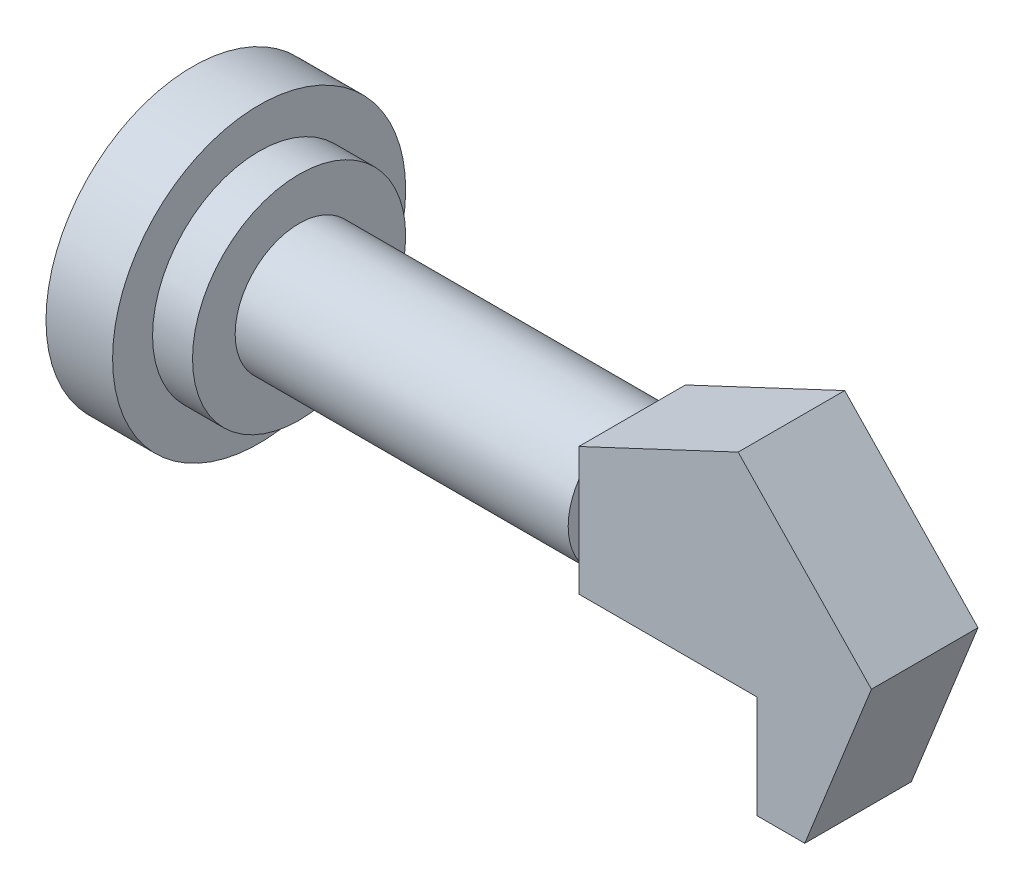
ISO-10303-21;
HEADER;
FILE_DESCRIPTION(('STEP AP214'),'2;1');
FILE_NAME('part.step','',(''),(''),'','','');
FILE_SCHEMA(('AUTOMOTIVE_DESIGN { 1 0 10303 214 1 1 1 1 }'));
ENDSEC;
DATA;
#1=APPLICATION_CONTEXT('core data for automotive mechanical design processes');
#2=APPLICATION_PROTOCOL_DEFINITION('international standard','automotive_design',2000,#1);
#3=PRODUCT_CONTEXT('',#1,'mechanical');
#4=PRODUCT('Part','Part','',(#3));
#5=PRODUCT_RELATED_PRODUCT_CATEGORY('part','',(#4));
#6=PRODUCT_DEFINITION_FORMATION('','',#4);
#7=PRODUCT_DEFINITION_CONTEXT('part definition',#1,'design');
#8=PRODUCT_DEFINITION('design','',#6,#7);
#9=PRODUCT_DEFINITION_SHAPE('','',#8);
#10=(LENGTH_UNIT() NAMED_UNIT(*) SI_UNIT(.MILLI.,.METRE.));
#11=(NAMED_UNIT(*) PLANE_ANGLE_UNIT() SI_UNIT($,.RADIAN.));
#12=(NAMED_UNIT(*) SI_UNIT($,.STERADIAN.) SOLID_ANGLE_UNIT());
#13=UNCERTAINTY_MEASURE_WITH_UNIT(LENGTH_MEASURE(1.E-05),#10,'distance_accuracy_value','');
#14=(GEOMETRIC_REPRESENTATION_CONTEXT(3) GLOBAL_UNCERTAINTY_ASSIGNED_CONTEXT((#13)) GLOBAL_UNIT_ASSIGNED_CONTEXT((#10,
#11,#12)) REPRESENTATION_CONTEXT('',''));
#15=CARTESIAN_POINT('',(0.,0.,0.));
#16=DIRECTION('',(0.,0.,1.));
#17=DIRECTION('',(1.,0.,0.));
#18=AXIS2_PLACEMENT_3D('',#15,#16,#17);
#19=CARTESIAN_POINT('',(33.,0.,0.));
#20=DIRECTION('',(-1.,0.,0.));
#21=DIRECTION('',(0.,0.,1.));
#22=AXIS2_PLACEMENT_3D('',#19,#20,#21);
#23=PLANE('',#22);
#24=DIRECTION('',(0.,-1.,0.));
#25=VECTOR('',#24,1.);
#26=CARTESIAN_POINT('',(33.,0.,4.));
#27=LINE('',#26,#25);
#28=CARTESIAN_POINT('',(33.,13.6532998322843,4.));
#29=VERTEX_POINT('',#28);
#30=CARTESIAN_POINT('',(33.,8.34670016771568,4.));
#31=VERTEX_POINT('',#30);
#32=EDGE_CURVE('E11',#29,#31,#27,.T.);
#33=ORIENTED_EDGE('',*,*,#32,.F.);
#34=CARTESIAN_POINT('',(33.,11.,0.));
#35=DIRECTION('',(-1.,0.,0.));
#36=DIRECTION('',(0.,0.,1.));
#37=AXIS2_PLACEMENT_3D('',#34,#35,#36);
#38=CIRCLE('',#37,4.8);
#39=EDGE_CURVE('E197',#31,#29,#38,.T.);
#40=ORIENTED_EDGE('',*,*,#39,.F.);
#41=EDGE_LOOP('',(#33,#40));
#42=FACE_BOUND('',#41,.T.);
#43=ADVANCED_FACE('F47',(#42),#23,.F.);
#44=CARTESIAN_POINT('',(0.,0.,0.));
#45=DIRECTION('',(1.,0.,0.));
#46=DIRECTION('',(0.,0.,-1.));
#47=AXIS2_PLACEMENT_3D('',#44,#45,#46);
#48=PLANE('',#47);
#49=CARTESIAN_POINT('',(0.,11.,0.));
#50=DIRECTION('',(-1.,0.,0.));
#51=DIRECTION('',(0.,0.,1.));
#52=AXIS2_PLACEMENT_3D('',#49,#50,#51);
#53=CIRCLE('',#52,11.);
#54=CARTESIAN_POINT('',(0.,11.,11.));
#55=VERTEX_POINT('',#54);
#56=EDGE_CURVE('E51',#55,#55,#53,.T.);
#57=ORIENTED_EDGE('',*,*,#56,.T.);
#58=EDGE_LOOP('',(#57));
#59=FACE_BOUND('',#58,.T.);
#60=ADVANCED_FACE('F49',(#59),#48,.F.);
#61=CARTESIAN_POINT('',(0.,11.,0.));
#62=DIRECTION('',(-1.,0.,0.));
#63=DIRECTION('',(0.,0.,1.));
#64=AXIS2_PLACEMENT_3D('',#61,#62,#63);
#65=CYLINDRICAL_SURFACE('',#64,11.);
#66=CARTESIAN_POINT('',(5.,11.,0.));
#67=DIRECTION('',(-1.,0.,0.));
#68=DIRECTION('',(0.,0.,1.));
#69=AXIS2_PLACEMENT_3D('',#66,#67,#68);
#70=CIRCLE('',#69,11.);
#71=CARTESIAN_POINT('',(5.,11.,11.));
#72=VERTEX_POINT('',#71);
#73=EDGE_CURVE('E231',#72,#72,#70,.T.);
#74=ORIENTED_EDGE('',*,*,#73,.T.);
#75=EDGE_LOOP('',(#74));
#76=FACE_BOUND('',#75,.T.);
#77=ORIENTED_EDGE('',*,*,#56,.F.);
#78=EDGE_LOOP('',(#77));
#79=FACE_BOUND('',#78,.T.);
#80=ADVANCED_FACE('F295',(#76,#79),#65,.T.);
#81=CARTESIAN_POINT('',(5.,0.,0.));
#82=DIRECTION('',(1.,0.,0.));
#83=DIRECTION('',(0.,0.,-1.));
#84=AXIS2_PLACEMENT_3D('',#81,#82,#83);
#85=PLANE('',#84);
#86=CARTESIAN_POINT('',(5.,11.,0.));
#87=DIRECTION('',(-1.,0.,0.));
#88=DIRECTION('',(0.,0.,1.));
#89=AXIS2_PLACEMENT_3D('',#86,#87,#88);
#90=CIRCLE('',#89,8.);
#91=CARTESIAN_POINT('',(5.,11.,8.));
#92=VERTEX_POINT('',#91);
#93=EDGE_CURVE('E228',#92,#92,#90,.T.);
#94=ORIENTED_EDGE('',*,*,#93,.T.);
#95=EDGE_LOOP('',(#94));
#96=FACE_BOUND('',#95,.T.);
#97=ORIENTED_EDGE('',*,*,#73,.F.);
#98=EDGE_LOOP('',(#97));
#99=FACE_BOUND('',#98,.T.);
#100=ADVANCED_FACE('F313',(#96,#99),#85,.T.);
#101=CARTESIAN_POINT('',(0.,11.,0.));
#102=DIRECTION('',(-1.,0.,0.));
#103=DIRECTION('',(0.,0.,1.));
#104=AXIS2_PLACEMENT_3D('',#101,#102,#103);
#105=CYLINDRICAL_SURFACE('',#104,8.);
#106=CARTESIAN_POINT('',(8.00000000000002,11.,0.));
#107=DIRECTION('',(-1.,0.,0.));
#108=DIRECTION('',(0.,0.,1.));
#109=AXIS2_PLACEMENT_3D('',#106,#107,#108);
#110=CIRCLE('',#109,8.);
#111=CARTESIAN_POINT('',(8.00000000000002,11.,8.));
#112=VERTEX_POINT('',#111);
#113=EDGE_CURVE('E224',#112,#112,#110,.T.);
#114=ORIENTED_EDGE('',*,*,#113,.T.);
#115=EDGE_LOOP('',(#114));
#116=FACE_BOUND('',#115,.T.);
#117=ORIENTED_EDGE('',*,*,#93,.F.);
#118=EDGE_LOOP('',(#117));
#119=FACE_BOUND('',#118,.T.);
#120=ADVANCED_FACE('F307',(#116,#119),#105,.T.);
#121=CARTESIAN_POINT('',(8.00000000000002,0.,0.));
#122=DIRECTION('',(-1.,0.,0.));
#123=DIRECTION('',(0.,0.,1.));
#124=AXIS2_PLACEMENT_3D('',#121,#122,#123);
#125=PLANE('',#124);
#126=ORIENTED_EDGE('',*,*,#113,.F.);
#127=EDGE_LOOP('',(#126));
#128=FACE_BOUND('',#127,.T.);
#129=CARTESIAN_POINT('',(8.00000000000002,11.,0.));
#130=DIRECTION('',(-1.,0.,0.));
#131=DIRECTION('',(0.,0.,1.));
#132=AXIS2_PLACEMENT_3D('',#129,#130,#131);
#133=CIRCLE('',#132,4.8);
#134=CARTESIAN_POINT('',(8.00000000000002,11.,4.8));
#135=VERTEX_POINT('',#134);
#136=EDGE_CURVE('E219',#135,#135,#133,.T.);
#137=ORIENTED_EDGE('',*,*,#136,.T.);
#138=EDGE_LOOP('',(#137));
#139=FACE_BOUND('',#138,.T.);
#140=ADVANCED_FACE('F304',(#128,#139),#125,.F.);
#141=CARTESIAN_POINT('',(0.,11.,0.));
#142=DIRECTION('',(-1.,0.,0.));
#143=DIRECTION('',(0.,0.,1.));
#144=AXIS2_PLACEMENT_3D('',#141,#142,#143);
#145=CYLINDRICAL_SURFACE('',#144,4.8);
#146=CARTESIAN_POINT('',(33.,15.8,0.));
#147=VERTEX_POINT('',#146);
#148=EDGE_CURVE('E215',#29,#147,#38,.T.);
#149=ORIENTED_EDGE('',*,*,#148,.T.);
#150=CARTESIAN_POINT('',(33.,13.6532998322843,-4.));
#151=VERTEX_POINT('',#150);
#152=EDGE_CURVE('E220',#147,#151,#38,.T.);
#153=ORIENTED_EDGE('',*,*,#152,.T.);
#154=CARTESIAN_POINT('',(33.,8.34670016771568,-4.));
#155=VERTEX_POINT('',#154);
#156=EDGE_CURVE('E274',#151,#155,#38,.T.);
#157=ORIENTED_EDGE('',*,*,#156,.T.);
#158=CARTESIAN_POINT('',(33.,6.2,0.));
#159=VERTEX_POINT('',#158);
#160=EDGE_CURVE('E248',#155,#159,#38,.T.);
#161=ORIENTED_EDGE('',*,*,#160,.T.);
#162=EDGE_CURVE('E284',#159,#31,#38,.T.);
#163=ORIENTED_EDGE('',*,*,#162,.T.);
#164=ORIENTED_EDGE('',*,*,#39,.T.);
#165=EDGE_LOOP('',(#149,#153,#157,#161,#163,#164));
#166=FACE_BOUND('',#165,.T.);
#167=ORIENTED_EDGE('',*,*,#136,.F.);
#168=EDGE_LOOP('',(#167));
#169=FACE_BOUND('',#168,.T.);
#170=ADVANCED_FACE('F278',(#166,#169),#145,.T.);
#171=ORIENTED_EDGE('',*,*,#156,.F.);
#172=DIRECTION('',(0.,-1.,0.));
#173=VECTOR('',#172,1.);
#174=CARTESIAN_POINT('',(33.,0.,-4.));
#175=LINE('',#174,#173);
#176=EDGE_CURVE('E57',#151,#155,#175,.T.);
#177=ORIENTED_EDGE('',*,*,#176,.T.);
#178=EDGE_LOOP('',(#171,#177));
#179=FACE_BOUND('',#178,.T.);
#180=ADVANCED_FACE('F275',(#179),#23,.F.);
#181=CARTESIAN_POINT('',(33.,0.,-4.));
#182=DIRECTION('',(-1.,0.,0.));
#183=DIRECTION('',(0.,0.,1.));
#184=AXIS2_PLACEMENT_3D('',#181,#182,#183);
#185=PLANE('',#184);
#186=ORIENTED_EDGE('',*,*,#148,.F.);
#187=CARTESIAN_POINT('',(33.,15.8,4.));
#188=VERTEX_POINT('',#187);
#189=EDGE_CURVE('E59',#188,#29,#27,.T.);
#190=ORIENTED_EDGE('',*,*,#189,.F.);
#191=DIRECTION('',(0.,0.,1.));
#192=VECTOR('',#191,1.);
#193=CARTESIAN_POINT('',(33.,15.8,-4.));
#194=LINE('',#193,#192);
#195=EDGE_CURVE('E203',#147,#188,#194,.T.);
#196=ORIENTED_EDGE('',*,*,#195,.F.);
#197=EDGE_LOOP('',(#186,#190,#196));
#198=FACE_BOUND('',#197,.T.);
#199=ADVANCED_FACE('F262',(#198),#185,.T.);
#200=ORIENTED_EDGE('',*,*,#152,.F.);
#201=CARTESIAN_POINT('',(33.,15.8,-4.));
#202=VERTEX_POINT('',#201);
#203=EDGE_CURVE('E199',#202,#147,#194,.T.);
#204=ORIENTED_EDGE('',*,*,#203,.F.);
#205=EDGE_CURVE('E141',#202,#151,#175,.T.);
#206=ORIENTED_EDGE('',*,*,#205,.T.);
#207=EDGE_LOOP('',(#200,#204,#206));
#208=FACE_BOUND('',#207,.T.);
#209=ADVANCED_FACE('F272',(#208),#185,.T.);
#210=ORIENTED_EDGE('',*,*,#160,.F.);
#211=CARTESIAN_POINT('',(33.,6.2,-4.));
#212=VERTEX_POINT('',#211);
#213=EDGE_CURVE('E67',#155,#212,#175,.T.);
#214=ORIENTED_EDGE('',*,*,#213,.T.);
#215=DIRECTION('',(0.,0.,1.));
#216=VECTOR('',#215,1.);
#217=CARTESIAN_POINT('',(33.,6.2,-4.));
#218=LINE('',#217,#216);
#219=EDGE_CURVE('E193',#212,#159,#218,.T.);
#220=ORIENTED_EDGE('',*,*,#219,.T.);
#221=EDGE_LOOP('',(#210,#214,#220));
#222=FACE_BOUND('',#221,.T.);
#223=ADVANCED_FACE('F246',(#222),#185,.T.);
#224=ORIENTED_EDGE('',*,*,#162,.F.);
#225=CARTESIAN_POINT('',(33.,6.2,4.));
#226=VERTEX_POINT('',#225);
#227=EDGE_CURVE('E198',#159,#226,#218,.T.);
#228=ORIENTED_EDGE('',*,*,#227,.T.);
#229=EDGE_CURVE('E60',#31,#226,#27,.T.);
#230=ORIENTED_EDGE('',*,*,#229,.F.);
#231=EDGE_LOOP('',(#224,#228,#230));
#232=FACE_BOUND('',#231,.T.);
#233=ADVANCED_FACE('F303',(#232),#185,.T.);
#234=CARTESIAN_POINT('',(0.,6.2,-4.));
#235=DIRECTION('',(0.,1.,0.));
#236=DIRECTION('',(0.,0.,1.));
#237=AXIS2_PLACEMENT_3D('',#234,#235,#236);
#238=PLANE('',#237);
#239=DIRECTION('',(0.,0.,1.));
#240=VECTOR('',#239,1.);
#241=CARTESIAN_POINT('',(46.3880944577165,6.2,-4.));
#242=LINE('',#241,#240);
#243=CARTESIAN_POINT('',(46.3880944577165,6.2,-4.));
#244=VERTEX_POINT('',#243);
#245=CARTESIAN_POINT('',(46.3880944577165,6.2,4.));
#246=VERTEX_POINT('',#245);
#247=EDGE_CURVE('E129',#244,#246,#242,.T.);
#248=ORIENTED_EDGE('',*,*,#247,.T.);
#249=DIRECTION('',(-1.,0.,0.));
#250=VECTOR('',#249,1.);
#251=CARTESIAN_POINT('',(0.,6.2,4.));
#252=LINE('',#251,#250);
#253=EDGE_CURVE('E133',#246,#226,#252,.T.);
#254=ORIENTED_EDGE('',*,*,#253,.T.);
#255=ORIENTED_EDGE('',*,*,#227,.F.);
#256=ORIENTED_EDGE('',*,*,#219,.F.);
#257=DIRECTION('',(-1.,0.,0.));
#258=VECTOR('',#257,1.);
#259=CARTESIAN_POINT('',(0.,6.2,-4.));
#260=LINE('',#259,#258);
#261=EDGE_CURVE('E135',#244,#212,#260,.T.);
#262=ORIENTED_EDGE('',*,*,#261,.F.);
#263=EDGE_LOOP('',(#248,#254,#255,#256,#262));
#264=FACE_BOUND('',#263,.T.);
#265=ADVANCED_FACE('F131',(#264),#238,.F.);
#266=CARTESIAN_POINT('',(-0.117969401692596,0.251268538874657,-4.));
#267=DIRECTION('',(0.424986919648818,-0.905199490790516,0.));
#268=DIRECTION('',(0.905199490790516,0.424986919648818,0.));
#269=AXIS2_PLACEMENT_3D('',#266,#267,#268);
#270=PLANE('',#269);
#271=ORIENTED_EDGE('',*,*,#203,.T.);
#272=ORIENTED_EDGE('',*,*,#195,.T.);
#273=DIRECTION('',(0.905199490790516,0.424986919648818,0.));
#274=VECTOR('',#273,1.);
#275=CARTESIAN_POINT('',(-0.117969401692596,0.251268538874657,4.));
#276=LINE('',#275,#274);
#277=CARTESIAN_POINT('',(44.9580769399876,21.4142610942155,4.));
#278=VERTEX_POINT('',#277);
#279=EDGE_CURVE('E168',#188,#278,#276,.T.);
#280=ORIENTED_EDGE('',*,*,#279,.T.);
#281=DIRECTION('',(0.,0.,1.));
#282=VECTOR('',#281,1.);
#283=CARTESIAN_POINT('',(44.9580769399876,21.4142610942155,-4.));
#284=LINE('',#283,#282);
#285=CARTESIAN_POINT('',(44.9580769399876,21.4142610942155,-4.));
#286=VERTEX_POINT('',#285);
#287=EDGE_CURVE('E204',#286,#278,#284,.T.);
#288=ORIENTED_EDGE('',*,*,#287,.F.);
#289=DIRECTION('',(0.905199490790516,0.424986919648818,0.));
#290=VECTOR('',#289,1.);
#291=CARTESIAN_POINT('',(-0.117969401692596,0.251268538874657,-4.));
#292=LINE('',#291,#290);
#293=EDGE_CURVE('E188',#202,#286,#292,.T.);
#294=ORIENTED_EDGE('',*,*,#293,.F.);
#295=EDGE_LOOP('',(#271,#272,#280,#288,#294));
#296=FACE_BOUND('',#295,.T.);
#297=ADVANCED_FACE('F257',(#296),#270,.F.);
#298=CARTESIAN_POINT('',(34.0748807776355,32.740883206711,-4.));
#299=DIRECTION('',(-0.721080686658289,-0.692851097515484,0.));
#300=DIRECTION('',(0.692851097515484,-0.721080686658289,0.));
#301=AXIS2_PLACEMENT_3D('',#298,#299,#300);
#302=PLANE('',#301);
#303=ORIENTED_EDGE('',*,*,#287,.T.);
#304=DIRECTION('',(0.692851097515484,-0.721080686658289,0.));
#305=VECTOR('',#304,1.);
#306=CARTESIAN_POINT('',(34.0748807776355,32.740883206711,4.));
#307=LINE('',#306,#305);
#308=CARTESIAN_POINT('',(54.9646301072607,11.,4.));
#309=VERTEX_POINT('',#308);
#310=EDGE_CURVE('E164',#278,#309,#307,.T.);
#311=ORIENTED_EDGE('',*,*,#310,.T.);
#312=DIRECTION('',(0.,0.,1.));
#313=VECTOR('',#312,1.);
#314=CARTESIAN_POINT('',(54.9646301072607,11.,-4.));
#315=LINE('',#314,#313);
#316=CARTESIAN_POINT('',(54.9646301072607,11.,-4.));
#317=VERTEX_POINT('',#316);
#318=EDGE_CURVE('E207',#317,#309,#315,.T.);
#319=ORIENTED_EDGE('',*,*,#318,.F.);
#320=DIRECTION('',(0.692851097515484,-0.721080686658289,0.));
#321=VECTOR('',#320,1.);
#322=CARTESIAN_POINT('',(34.0748807776355,32.740883206711,-4.));
#323=LINE('',#322,#321);
#324=EDGE_CURVE('E185',#286,#317,#323,.T.);
#325=ORIENTED_EDGE('',*,*,#324,.F.);
#326=EDGE_LOOP('',(#303,#311,#319,#325));
#327=FACE_BOUND('',#326,.T.);
#328=ADVANCED_FACE('F268',(#327),#302,.F.);
#329=CARTESIAN_POINT('',(43.6018634733805,-17.4278825766866,-4.));
#330=DIRECTION('',(-0.928571120881615,0.37115451427224,0.));
#331=DIRECTION('',(-0.37115451427224,-0.928571120881615,0.));
#332=AXIS2_PLACEMENT_3D('',#329,#330,#331);
#333=PLANE('',#332);
#334=ORIENTED_EDGE('',*,*,#318,.T.);
#335=DIRECTION('',(-0.37115451427224,-0.928571120881615,0.));
#336=VECTOR('',#335,1.);
#337=CARTESIAN_POINT('',(43.6018634733805,-17.4278825766866,4.));
#338=LINE('',#337,#336);
#339=CARTESIAN_POINT('',(49.9613535236241,-1.51742324745218,4.));
#340=VERTEX_POINT('',#339);
#341=EDGE_CURVE('E158',#309,#340,#338,.T.);
#342=ORIENTED_EDGE('',*,*,#341,.T.);
#343=DIRECTION('',(0.,0.,1.));
#344=VECTOR('',#343,1.);
#345=CARTESIAN_POINT('',(49.9613535236241,-1.51742324745218,-4.));
#346=LINE('',#345,#344);
#347=CARTESIAN_POINT('',(49.9613535236241,-1.51742324745218,-4.));
#348=VERTEX_POINT('',#347);
#349=EDGE_CURVE('E210',#348,#340,#346,.T.);
#350=ORIENTED_EDGE('',*,*,#349,.F.);
#351=DIRECTION('',(-0.37115451427224,-0.928571120881615,0.));
#352=VECTOR('',#351,1.);
#353=CARTESIAN_POINT('',(43.6018634733805,-17.4278825766866,-4.));
#354=LINE('',#353,#352);
#355=EDGE_CURVE('E182',#317,#348,#354,.T.);
#356=ORIENTED_EDGE('',*,*,#355,.F.);
#357=EDGE_LOOP('',(#334,#342,#350,#356));
#358=FACE_BOUND('',#357,.T.);
#359=ADVANCED_FACE('F404',(#358),#333,.F.);
#360=CARTESIAN_POINT('',(0.,-1.51742324745217,-4.));
#361=DIRECTION('',(0.,1.,0.));
#362=DIRECTION('',(0.,0.,1.));
#363=AXIS2_PLACEMENT_3D('',#360,#361,#362);
#364=PLANE('',#363);
#365=ORIENTED_EDGE('',*,*,#349,.T.);
#366=DIRECTION('',(-1.,0.,0.));
#367=VECTOR('',#366,1.);
#368=CARTESIAN_POINT('',(0.,-1.51742324745217,4.));
#369=LINE('',#368,#367);
#370=CARTESIAN_POINT('',(46.3880944577165,-1.51742324745217,4.));
#371=VERTEX_POINT('',#370);
#372=EDGE_CURVE('E155',#340,#371,#369,.T.);
#373=ORIENTED_EDGE('',*,*,#372,.T.);
#374=DIRECTION('',(0.,0.,1.));
#375=VECTOR('',#374,1.);
#376=CARTESIAN_POINT('',(46.3880944577165,-1.51742324745217,-4.));
#377=LINE('',#376,#375);
#378=CARTESIAN_POINT('',(46.3880944577165,-1.51742324745217,-4.));
#379=VERTEX_POINT('',#378);
#380=EDGE_CURVE('E140',#379,#371,#377,.T.);
#381=ORIENTED_EDGE('',*,*,#380,.F.);
#382=DIRECTION('',(-1.,0.,0.));
#383=VECTOR('',#382,1.);
#384=CARTESIAN_POINT('',(0.,-1.51742324745217,-4.));
#385=LINE('',#384,#383);
#386=EDGE_CURVE('E179',#348,#379,#385,.T.);
#387=ORIENTED_EDGE('',*,*,#386,.F.);
#388=EDGE_LOOP('',(#365,#373,#381,#387));
#389=FACE_BOUND('',#388,.T.);
#390=ADVANCED_FACE('F413',(#389),#364,.F.);
#391=CARTESIAN_POINT('',(46.3880944577165,0.,-4.));
#392=DIRECTION('',(1.,0.,0.));
#393=DIRECTION('',(0.,0.,-1.));
#394=AXIS2_PLACEMENT_3D('',#391,#392,#393);
#395=PLANE('',#394);
#396=ORIENTED_EDGE('',*,*,#380,.T.);
#397=DIRECTION('',(0.,1.,0.));
#398=VECTOR('',#397,1.);
#399=CARTESIAN_POINT('',(46.3880944577165,0.,4.));
#400=LINE('',#399,#398);
#401=EDGE_CURVE('E147',#371,#246,#400,.T.);
#402=ORIENTED_EDGE('',*,*,#401,.T.);
#403=ORIENTED_EDGE('',*,*,#247,.F.);
#404=DIRECTION('',(0.,1.,0.));
#405=VECTOR('',#404,1.);
#406=CARTESIAN_POINT('',(46.3880944577165,0.,-4.));
#407=LINE('',#406,#405);
#408=EDGE_CURVE('E176',#379,#244,#407,.T.);
#409=ORIENTED_EDGE('',*,*,#408,.F.);
#410=EDGE_LOOP('',(#396,#402,#403,#409));
#411=FACE_BOUND('',#410,.T.);
#412=ADVANCED_FACE('F152',(#411),#395,.F.);
#413=CARTESIAN_POINT('',(0.,0.,-4.));
#414=DIRECTION('',(0.,0.,1.));
#415=DIRECTION('',(1.,0.,0.));
#416=AXIS2_PLACEMENT_3D('',#413,#414,#415);
#417=PLANE('',#416);
#418=ORIENTED_EDGE('',*,*,#261,.T.);
#419=ORIENTED_EDGE('',*,*,#213,.F.);
#420=ORIENTED_EDGE('',*,*,#176,.F.);
#421=ORIENTED_EDGE('',*,*,#205,.F.);
#422=ORIENTED_EDGE('',*,*,#293,.T.);
#423=ORIENTED_EDGE('',*,*,#324,.T.);
#424=ORIENTED_EDGE('',*,*,#355,.T.);
#425=ORIENTED_EDGE('',*,*,#386,.T.);
#426=ORIENTED_EDGE('',*,*,#408,.T.);
#427=EDGE_LOOP('',(#418,#419,#420,#421,#422,#423,#424,#425,#426));
#428=FACE_BOUND('',#427,.T.);
#429=ADVANCED_FACE('F249',(#428),#417,.F.);
#430=CARTESIAN_POINT('',(0.,0.,4.));
#431=DIRECTION('',(0.,0.,1.));
#432=DIRECTION('',(1.,0.,0.));
#433=AXIS2_PLACEMENT_3D('',#430,#431,#432);
#434=PLANE('',#433);
#435=ORIENTED_EDGE('',*,*,#253,.F.);
#436=ORIENTED_EDGE('',*,*,#401,.F.);
#437=ORIENTED_EDGE('',*,*,#372,.F.);
#438=ORIENTED_EDGE('',*,*,#341,.F.);
#439=ORIENTED_EDGE('',*,*,#310,.F.);
#440=ORIENTED_EDGE('',*,*,#279,.F.);
#441=ORIENTED_EDGE('',*,*,#189,.T.);
#442=ORIENTED_EDGE('',*,*,#32,.T.);
#443=ORIENTED_EDGE('',*,*,#229,.T.);
#444=EDGE_LOOP('',(#435,#436,#437,#438,#439,#440,#441,#442,#443));
#445=FACE_BOUND('',#444,.T.);
#446=ADVANCED_FACE('F145',(#445),#434,.T.);
#447=CLOSED_SHELL('',(#43,#60,#80,#100,#120,#140,#170,#180,#199,#209,#223,#233,#265,#297,#328,
#359,#390,#412,#429,#446));
#448=MANIFOLD_SOLID_BREP('B2',#447);
#449=ADVANCED_BREP_SHAPE_REPRESENTATION('',(#18,#448),#14);
#450=SHAPE_DEFINITION_REPRESENTATION(#9,#449);
ENDSEC;
END-ISO-10303-21;
